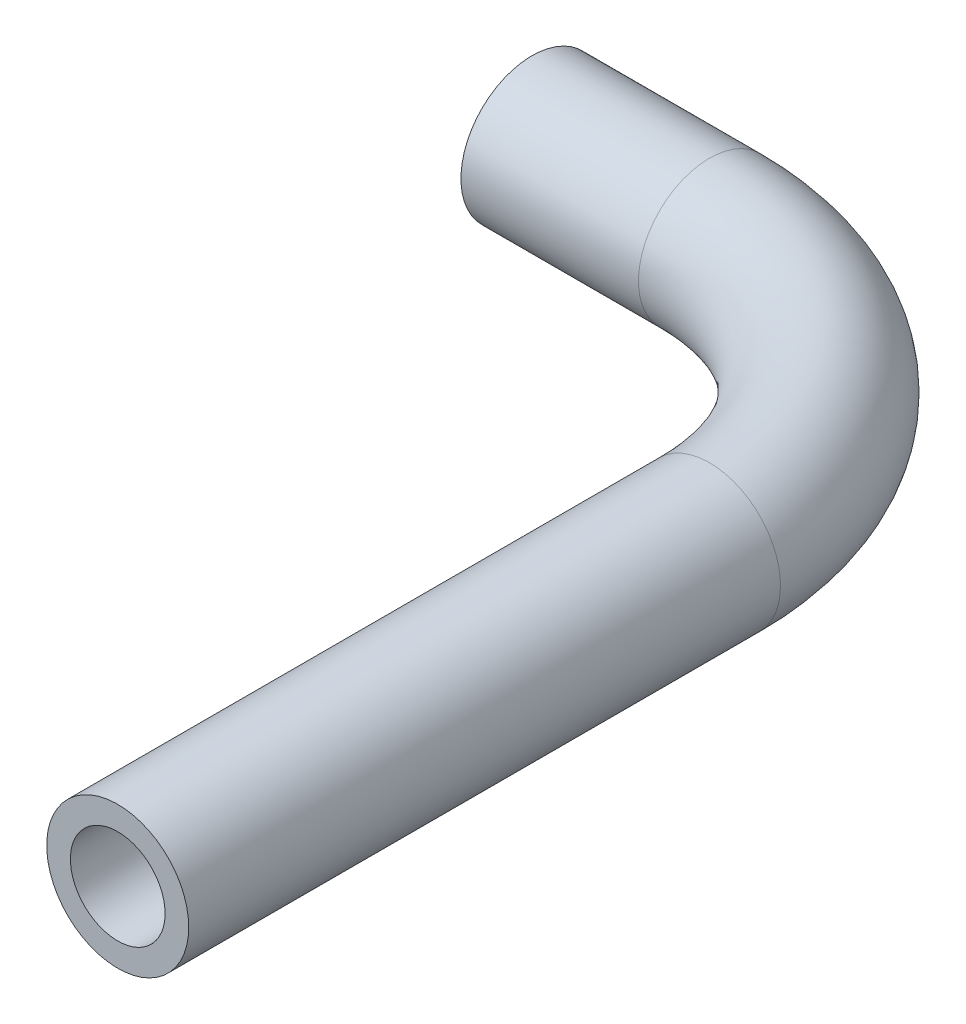
ISO-10303-21;
HEADER;
FILE_DESCRIPTION(('STEP AP214'),'2;1');
FILE_NAME('part.step','',(''),(''),'','','');
FILE_SCHEMA(('AUTOMOTIVE_DESIGN { 1 0 10303 214 1 1 1 1 }'));
ENDSEC;
DATA;
#1=APPLICATION_CONTEXT('core data for automotive mechanical design processes');
#2=APPLICATION_PROTOCOL_DEFINITION('international standard','automotive_design',2000,#1);
#3=PRODUCT_CONTEXT('',#1,'mechanical');
#4=PRODUCT('Part','Part','',(#3));
#5=PRODUCT_RELATED_PRODUCT_CATEGORY('part','',(#4));
#6=PRODUCT_DEFINITION_FORMATION('','',#4);
#7=PRODUCT_DEFINITION_CONTEXT('part definition',#1,'design');
#8=PRODUCT_DEFINITION('design','',#6,#7);
#9=PRODUCT_DEFINITION_SHAPE('','',#8);
#10=(LENGTH_UNIT() NAMED_UNIT(*) SI_UNIT(.MILLI.,.METRE.));
#11=(NAMED_UNIT(*) PLANE_ANGLE_UNIT() SI_UNIT($,.RADIAN.));
#12=(NAMED_UNIT(*) SI_UNIT($,.STERADIAN.) SOLID_ANGLE_UNIT());
#13=UNCERTAINTY_MEASURE_WITH_UNIT(LENGTH_MEASURE(1.E-05),#10,'distance_accuracy_value','');
#14=(GEOMETRIC_REPRESENTATION_CONTEXT(3) GLOBAL_UNCERTAINTY_ASSIGNED_CONTEXT((#13)) GLOBAL_UNIT_ASSIGNED_CONTEXT((#10,
#11,#12)) REPRESENTATION_CONTEXT('',''));
#15=CARTESIAN_POINT('',(0.,0.,0.));
#16=DIRECTION('',(0.,0.,1.));
#17=DIRECTION('',(1.,0.,0.));
#18=AXIS2_PLACEMENT_3D('',#15,#16,#17);
#19=CARTESIAN_POINT('',(0.,0.,100.));
#20=DIRECTION('',(0.,0.,-1.));
#21=DIRECTION('',(-1.,0.,0.));
#22=AXIS2_PLACEMENT_3D('',#19,#20,#21);
#23=CYLINDRICAL_SURFACE('',#22,4.);
#24=CARTESIAN_POINT('',(0.,0.,50.));
#25=DIRECTION('',(0.,0.,1.));
#26=DIRECTION('',(0.,-1.,0.));
#27=AXIS2_PLACEMENT_3D('',#24,#25,#26);
#28=CIRCLE('',#27,4.);
#29=CARTESIAN_POINT('',(4.,0.,50.));
#30=VERTEX_POINT('',#29);
#31=EDGE_CURVE('E104',#30,#30,#28,.T.);
#32=ORIENTED_EDGE('',*,*,#31,.F.);
#33=EDGE_LOOP('',(#32));
#34=FACE_BOUND('',#33,.T.);
#35=CARTESIAN_POINT('',(0.,0.,100.));
#36=DIRECTION('',(0.,0.,1.));
#37=DIRECTION('',(1.,0.,0.));
#38=AXIS2_PLACEMENT_3D('',#35,#36,#37);
#39=CIRCLE('',#38,4.);
#40=CARTESIAN_POINT('',(4.,0.,100.));
#41=VERTEX_POINT('',#40);
#42=EDGE_CURVE('E12',#41,#41,#39,.T.);
#43=ORIENTED_EDGE('',*,*,#42,.T.);
#44=EDGE_LOOP('',(#43));
#45=FACE_BOUND('',#44,.T.);
#46=ADVANCED_FACE('F91',(#34,#45),#23,.F.);
#47=CARTESIAN_POINT('',(62.7183079671346,0.,27.7183079671344));
#48=DIRECTION('',(-1.,0.,0.));
#49=DIRECTION('',(0.,0.,1.));
#50=AXIS2_PLACEMENT_3D('',#47,#48,#49);
#51=CYLINDRICAL_SURFACE('',#50,6.);
#52=CARTESIAN_POINT('',(-37.2816920328654,0.,27.7183079671347));
#53=DIRECTION('',(1.,0.,0.));
#54=DIRECTION('',(0.,0.,-1.));
#55=AXIS2_PLACEMENT_3D('',#52,#53,#54);
#56=CIRCLE('',#55,6.);
#57=CARTESIAN_POINT('',(-37.2816920328654,0.,21.7183079671347));
#58=VERTEX_POINT('',#57);
#59=EDGE_CURVE('E117',#58,#58,#56,.T.);
#60=ORIENTED_EDGE('',*,*,#59,.T.);
#61=EDGE_LOOP('',(#60));
#62=FACE_BOUND('',#61,.T.);
#63=CARTESIAN_POINT('',(-22.2816920328654,0.,27.7183079671347));
#64=DIRECTION('',(1.,0.,0.));
#65=DIRECTION('',(0.,-1.,0.));
#66=AXIS2_PLACEMENT_3D('',#63,#64,#65);
#67=CIRCLE('',#66,6.);
#68=CARTESIAN_POINT('',(-22.2816920328654,0.,21.7183079671347));
#69=VERTEX_POINT('',#68);
#70=EDGE_CURVE('E122',#69,#69,#67,.T.);
#71=ORIENTED_EDGE('',*,*,#70,.F.);
#72=EDGE_LOOP('',(#71));
#73=FACE_BOUND('',#72,.T.);
#74=ADVANCED_FACE('F137',(#62,#73),#51,.T.);
#75=CARTESIAN_POINT('',(-22.2816920328653,0.,50.));
#76=DIRECTION('',(0.,-1.,0.));
#77=DIRECTION('',(1.,0.,0.));
#78=AXIS2_PLACEMENT_3D('',#75,#76,#77);
#79=TOROIDAL_SURFACE('',#78,22.2816920328653,6.);
#80=CARTESIAN_POINT('',(0.,0.,50.));
#81=DIRECTION('',(0.,0.,1.));
#82=DIRECTION('',(0.,-1.,0.));
#83=AXIS2_PLACEMENT_3D('',#80,#81,#82);
#84=CIRCLE('',#83,6.);
#85=CARTESIAN_POINT('',(6.,0.,50.));
#86=VERTEX_POINT('',#85);
#87=EDGE_CURVE('E127',#86,#86,#84,.T.);
#88=CARTESIAN_POINT('',(-22.2816920328653,0.,50.));
#89=DIRECTION('',(0.,-1.,0.));
#90=DIRECTION('',(1.,0.,0.));
#91=AXIS2_PLACEMENT_3D('',#88,#89,#90);
#92=CIRCLE('',#91,28.2816920328653);
#93=EDGE_CURVE('',#69,#86,#92,.T.);
#94=ORIENTED_EDGE('',*,*,#70,.T.);
#95=ORIENTED_EDGE('',*,*,#87,.F.);
#96=ORIENTED_EDGE('',*,*,#93,.T.);
#97=ORIENTED_EDGE('',*,*,#93,.F.);
#98=EDGE_LOOP('',(#94,#96,#95,#97));
#99=FACE_BOUND('',#98,.T.);
#100=ADVANCED_FACE('F142',(#99),#79,.T.);
#101=CARTESIAN_POINT('',(62.7183079671346,0.,27.7183079671344));
#102=DIRECTION('',(-1.,0.,0.));
#103=DIRECTION('',(0.,0.,1.));
#104=AXIS2_PLACEMENT_3D('',#101,#102,#103);
#105=CYLINDRICAL_SURFACE('',#104,4.);
#106=CARTESIAN_POINT('',(-37.2816920328654,0.,27.7183079671347));
#107=DIRECTION('',(1.,0.,0.));
#108=DIRECTION('',(0.,0.,-1.));
#109=AXIS2_PLACEMENT_3D('',#106,#107,#108);
#110=CIRCLE('',#109,4.);
#111=CARTESIAN_POINT('',(-37.2816920328654,0.,23.7183079671347));
#112=VERTEX_POINT('',#111);
#113=EDGE_CURVE('E111',#112,#112,#110,.T.);
#114=ORIENTED_EDGE('',*,*,#113,.F.);
#115=EDGE_LOOP('',(#114));
#116=FACE_BOUND('',#115,.T.);
#117=CARTESIAN_POINT('',(-22.2816920328654,0.,27.7183079671347));
#118=DIRECTION('',(1.,0.,0.));
#119=DIRECTION('',(0.,-1.,0.));
#120=AXIS2_PLACEMENT_3D('',#117,#118,#119);
#121=CIRCLE('',#120,4.);
#122=CARTESIAN_POINT('',(-22.2816920328654,0.,23.7183079671347));
#123=VERTEX_POINT('',#122);
#124=EDGE_CURVE('E99',#123,#123,#121,.T.);
#125=ORIENTED_EDGE('',*,*,#124,.T.);
#126=EDGE_LOOP('',(#125));
#127=FACE_BOUND('',#126,.T.);
#128=ADVANCED_FACE('F148',(#116,#127),#105,.F.);
#129=CARTESIAN_POINT('',(0.,0.,100.));
#130=DIRECTION('',(0.,0.,-1.));
#131=DIRECTION('',(-1.,0.,0.));
#132=AXIS2_PLACEMENT_3D('',#129,#130,#131);
#133=CYLINDRICAL_SURFACE('',#132,6.);
#134=ORIENTED_EDGE('',*,*,#87,.T.);
#135=EDGE_LOOP('',(#134));
#136=FACE_BOUND('',#135,.T.);
#137=CARTESIAN_POINT('',(0.,0.,100.));
#138=DIRECTION('',(0.,0.,1.));
#139=DIRECTION('',(1.,0.,0.));
#140=AXIS2_PLACEMENT_3D('',#137,#138,#139);
#141=CIRCLE('',#140,6.);
#142=CARTESIAN_POINT('',(6.,0.,100.));
#143=VERTEX_POINT('',#142);
#144=EDGE_CURVE('E113',#143,#143,#141,.T.);
#145=ORIENTED_EDGE('',*,*,#144,.F.);
#146=EDGE_LOOP('',(#145));
#147=FACE_BOUND('',#146,.T.);
#148=ADVANCED_FACE('F152',(#136,#147),#133,.T.);
#149=CARTESIAN_POINT('',(-22.2816920328653,0.,50.));
#150=DIRECTION('',(0.,-1.,0.));
#151=DIRECTION('',(1.,0.,0.));
#152=AXIS2_PLACEMENT_3D('',#149,#150,#151);
#153=TOROIDAL_SURFACE('',#152,22.2816920328653,4.);
#154=CARTESIAN_POINT('',(-22.2816920328653,0.,50.));
#155=DIRECTION('',(0.,-1.,0.));
#156=DIRECTION('',(1.,0.,0.));
#157=AXIS2_PLACEMENT_3D('',#154,#155,#156);
#158=CIRCLE('',#157,26.2816920328653);
#159=EDGE_CURVE('',#123,#30,#158,.T.);
#160=ORIENTED_EDGE('',*,*,#124,.F.);
#161=ORIENTED_EDGE('',*,*,#31,.T.);
#162=ORIENTED_EDGE('',*,*,#159,.T.);
#163=ORIENTED_EDGE('',*,*,#159,.F.);
#164=EDGE_LOOP('',(#160,#162,#161,#163));
#165=FACE_BOUND('',#164,.T.);
#166=ADVANCED_FACE('F134',(#165),#153,.F.);
#167=CARTESIAN_POINT('',(0.,0.,100.));
#168=DIRECTION('',(0.,0.,1.));
#169=DIRECTION('',(1.,0.,0.));
#170=AXIS2_PLACEMENT_3D('',#167,#168,#169);
#171=PLANE('',#170);
#172=ORIENTED_EDGE('',*,*,#42,.F.);
#173=EDGE_LOOP('',(#172));
#174=FACE_BOUND('',#173,.T.);
#175=ORIENTED_EDGE('',*,*,#144,.T.);
#176=EDGE_LOOP('',(#175));
#177=FACE_BOUND('',#176,.T.);
#178=ADVANCED_FACE('F158',(#174,#177),#171,.T.);
#179=CARTESIAN_POINT('',(-37.2816920328654,0.,27.7183079671347));
#180=DIRECTION('',(1.,0.,0.));
#181=DIRECTION('',(0.,0.,-1.));
#182=AXIS2_PLACEMENT_3D('',#179,#180,#181);
#183=PLANE('',#182);
#184=ORIENTED_EDGE('',*,*,#113,.T.);
#185=EDGE_LOOP('',(#184));
#186=FACE_BOUND('',#185,.T.);
#187=ORIENTED_EDGE('',*,*,#59,.F.);
#188=EDGE_LOOP('',(#187));
#189=FACE_BOUND('',#188,.T.);
#190=ADVANCED_FACE('F93',(#186,#189),#183,.F.);
#191=CLOSED_SHELL('',(#46,#74,#100,#128,#148,#166,#178,#190));
#192=MANIFOLD_SOLID_BREP('B2',#191);
#193=ADVANCED_BREP_SHAPE_REPRESENTATION('',(#18,#192),#14);
#194=SHAPE_DEFINITION_REPRESENTATION(#9,#193);
ENDSEC;
END-ISO-10303-21;
